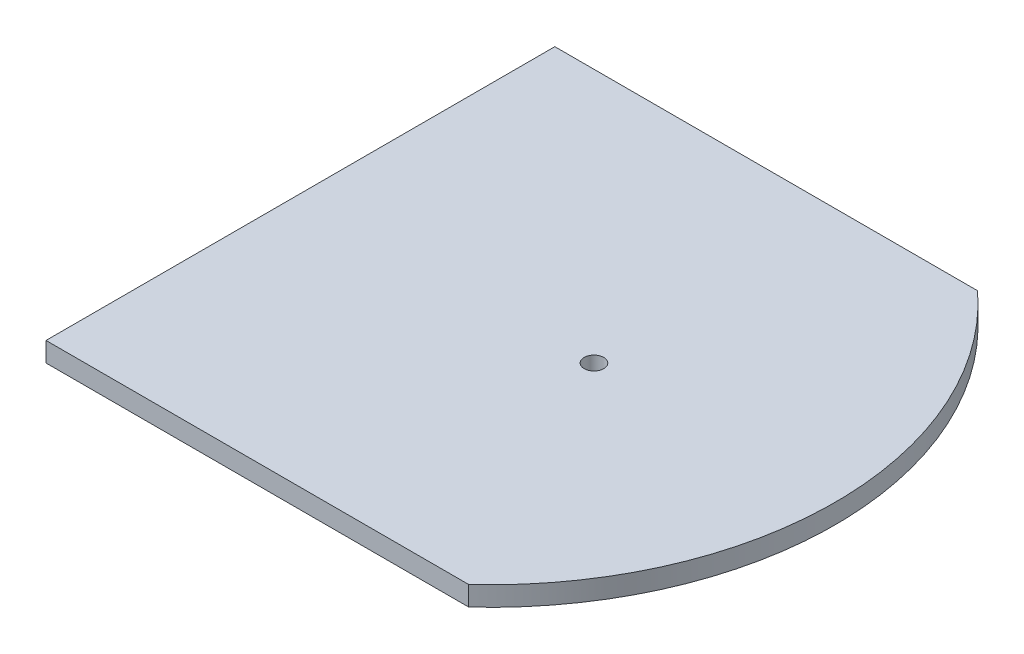
ISO-10303-21;
HEADER;
FILE_DESCRIPTION(('STEP AP214'),'2;1');
FILE_NAME('part.step','',(''),(''),'','','');
FILE_SCHEMA(('AUTOMOTIVE_DESIGN { 1 0 10303 214 1 1 1 1 }'));
ENDSEC;
DATA;
#1=APPLICATION_CONTEXT('core data for automotive mechanical design processes');
#2=APPLICATION_PROTOCOL_DEFINITION('international standard','automotive_design',2000,#1);
#3=PRODUCT_CONTEXT('',#1,'mechanical');
#4=PRODUCT('Part','Part','',(#3));
#5=PRODUCT_RELATED_PRODUCT_CATEGORY('part','',(#4));
#6=PRODUCT_DEFINITION_FORMATION('','',#4);
#7=PRODUCT_DEFINITION_CONTEXT('part definition',#1,'design');
#8=PRODUCT_DEFINITION('design','',#6,#7);
#9=PRODUCT_DEFINITION_SHAPE('','',#8);
#10=(LENGTH_UNIT() NAMED_UNIT(*) SI_UNIT(.MILLI.,.METRE.));
#11=(NAMED_UNIT(*) PLANE_ANGLE_UNIT() SI_UNIT($,.RADIAN.));
#12=(NAMED_UNIT(*) SI_UNIT($,.STERADIAN.) SOLID_ANGLE_UNIT());
#13=UNCERTAINTY_MEASURE_WITH_UNIT(LENGTH_MEASURE(1.E-05),#10,'distance_accuracy_value','');
#14=(GEOMETRIC_REPRESENTATION_CONTEXT(3) GLOBAL_UNCERTAINTY_ASSIGNED_CONTEXT((#13)) GLOBAL_UNIT_ASSIGNED_CONTEXT((#10,
#11,#12)) REPRESENTATION_CONTEXT('',''));
#15=CARTESIAN_POINT('',(0.,0.,0.));
#16=DIRECTION('',(0.,0.,1.));
#17=DIRECTION('',(1.,0.,0.));
#18=AXIS2_PLACEMENT_3D('',#15,#16,#17);
#19=CARTESIAN_POINT('',(48.515175396547,5.,65.));
#20=DIRECTION('',(0.,-1.,0.));
#21=DIRECTION('',(0.,0.,-1.));
#22=AXIS2_PLACEMENT_3D('',#19,#20,#21);
#23=PLANE('',#22);
#24=DIRECTION('',(0.,0.,1.));
#25=VECTOR('',#24,1.);
#26=CARTESIAN_POINT('',(0.,5.,0.));
#27=LINE('',#26,#25);
#28=CARTESIAN_POINT('',(0.,5.,0.));
#29=VERTEX_POINT('',#28);
#30=CARTESIAN_POINT('',(0.,5.,130.));
#31=VERTEX_POINT('',#30);
#32=EDGE_CURVE('E85',#29,#31,#27,.T.);
#33=ORIENTED_EDGE('',*,*,#32,.T.);
#34=DIRECTION('',(1.,0.,0.));
#35=VECTOR('',#34,1.);
#36=CARTESIAN_POINT('',(0.,5.,130.));
#37=LINE('',#36,#35);
#38=CARTESIAN_POINT('',(108.,5.,130.));
#39=VERTEX_POINT('',#38);
#40=EDGE_CURVE('E80',#31,#39,#37,.T.);
#41=ORIENTED_EDGE('',*,*,#40,.T.);
#42=CARTESIAN_POINT('',(48.515175396547,5.,65.));
#43=DIRECTION('',(0.,1.,0.));
#44=DIRECTION('',(0.,0.,-1.));
#45=AXIS2_PLACEMENT_3D('',#42,#43,#44);
#46=CIRCLE('',#45,88.1104100438964);
#47=CARTESIAN_POINT('',(108.,5.,0.));
#48=VERTEX_POINT('',#47);
#49=EDGE_CURVE('E83',#39,#48,#46,.T.);
#50=ORIENTED_EDGE('',*,*,#49,.T.);
#51=DIRECTION('',(-1.,0.,0.));
#52=VECTOR('',#51,1.);
#53=CARTESIAN_POINT('',(0.,5.,0.));
#54=LINE('',#53,#52);
#55=EDGE_CURVE('E50',#48,#29,#54,.T.);
#56=ORIENTED_EDGE('',*,*,#55,.T.);
#57=EDGE_LOOP('',(#33,#41,#50,#56));
#58=FACE_BOUND('',#57,.T.);
#59=CARTESIAN_POINT('',(75.,5.,65.));
#60=DIRECTION('',(0.,1.,0.));
#61=DIRECTION('',(0.,0.,1.));
#62=AXIS2_PLACEMENT_3D('',#59,#60,#61);
#63=CIRCLE('',#62,2.50000000000001);
#64=CARTESIAN_POINT('',(75.,5.,67.5));
#65=VERTEX_POINT('',#64);
#66=EDGE_CURVE('E100',#65,#65,#63,.T.);
#67=ORIENTED_EDGE('',*,*,#66,.F.);
#68=EDGE_LOOP('',(#67));
#69=FACE_BOUND('',#68,.T.);
#70=ADVANCED_FACE('F33',(#58,#69),#23,.F.);
#71=CARTESIAN_POINT('',(48.515175396547,0.,65.));
#72=DIRECTION('',(0.,-1.,0.));
#73=DIRECTION('',(0.,0.,-1.));
#74=AXIS2_PLACEMENT_3D('',#71,#72,#73);
#75=PLANE('',#74);
#76=DIRECTION('',(0.,0.,1.));
#77=VECTOR('',#76,1.);
#78=CARTESIAN_POINT('',(0.,0.,0.));
#79=LINE('',#78,#77);
#80=CARTESIAN_POINT('',(0.,0.,0.));
#81=VERTEX_POINT('',#80);
#82=CARTESIAN_POINT('',(0.,0.,130.));
#83=VERTEX_POINT('',#82);
#84=EDGE_CURVE('E97',#81,#83,#79,.T.);
#85=ORIENTED_EDGE('',*,*,#84,.F.);
#86=DIRECTION('',(-1.,0.,0.));
#87=VECTOR('',#86,1.);
#88=CARTESIAN_POINT('',(0.,0.,0.));
#89=LINE('',#88,#87);
#90=CARTESIAN_POINT('',(108.,0.,0.));
#91=VERTEX_POINT('',#90);
#92=EDGE_CURVE('E73',#91,#81,#89,.T.);
#93=ORIENTED_EDGE('',*,*,#92,.F.);
#94=CARTESIAN_POINT('',(48.515175396547,0.,65.));
#95=DIRECTION('',(0.,1.,0.));
#96=DIRECTION('',(0.,0.,-1.));
#97=AXIS2_PLACEMENT_3D('',#94,#95,#96);
#98=CIRCLE('',#97,88.1104100438964);
#99=CARTESIAN_POINT('',(108.,0.,130.));
#100=VERTEX_POINT('',#99);
#101=EDGE_CURVE('E67',#100,#91,#98,.T.);
#102=ORIENTED_EDGE('',*,*,#101,.F.);
#103=DIRECTION('',(1.,0.,0.));
#104=VECTOR('',#103,1.);
#105=CARTESIAN_POINT('',(0.,0.,130.));
#106=LINE('',#105,#104);
#107=EDGE_CURVE('E89',#83,#100,#106,.T.);
#108=ORIENTED_EDGE('',*,*,#107,.F.);
#109=EDGE_LOOP('',(#85,#93,#102,#108));
#110=FACE_BOUND('',#109,.T.);
#111=CARTESIAN_POINT('',(75.,0.,65.));
#112=DIRECTION('',(0.,1.,0.));
#113=DIRECTION('',(0.,0.,1.));
#114=AXIS2_PLACEMENT_3D('',#111,#112,#113);
#115=CIRCLE('',#114,2.50000000000001);
#116=CARTESIAN_POINT('',(75.,0.,67.5));
#117=VERTEX_POINT('',#116);
#118=EDGE_CURVE('E112',#117,#117,#115,.T.);
#119=ORIENTED_EDGE('',*,*,#118,.T.);
#120=EDGE_LOOP('',(#119));
#121=FACE_BOUND('',#120,.T.);
#122=ADVANCED_FACE('F108',(#110,#121),#75,.T.);
#123=CARTESIAN_POINT('',(0.,5.,0.));
#124=DIRECTION('',(1.,0.,0.));
#125=DIRECTION('',(0.,0.,-1.));
#126=AXIS2_PLACEMENT_3D('',#123,#124,#125);
#127=PLANE('',#126);
#128=ORIENTED_EDGE('',*,*,#84,.T.);
#129=DIRECTION('',(0.,-1.,0.));
#130=VECTOR('',#129,1.);
#131=CARTESIAN_POINT('',(0.,5.,130.));
#132=LINE('',#131,#130);
#133=EDGE_CURVE('E11',#31,#83,#132,.T.);
#134=ORIENTED_EDGE('',*,*,#133,.F.);
#135=ORIENTED_EDGE('',*,*,#32,.F.);
#136=DIRECTION('',(0.,-1.,0.));
#137=VECTOR('',#136,1.);
#138=CARTESIAN_POINT('',(0.,5.,0.));
#139=LINE('',#138,#137);
#140=EDGE_CURVE('E93',#29,#81,#139,.T.);
#141=ORIENTED_EDGE('',*,*,#140,.T.);
#142=EDGE_LOOP('',(#128,#134,#135,#141));
#143=FACE_BOUND('',#142,.T.);
#144=ADVANCED_FACE('F35',(#143),#127,.F.);
#145=CARTESIAN_POINT('',(0.,5.,130.));
#146=DIRECTION('',(0.,0.,-1.));
#147=DIRECTION('',(-1.,0.,0.));
#148=AXIS2_PLACEMENT_3D('',#145,#146,#147);
#149=PLANE('',#148);
#150=ORIENTED_EDGE('',*,*,#107,.T.);
#151=DIRECTION('',(0.,-1.,0.));
#152=VECTOR('',#151,1.);
#153=CARTESIAN_POINT('',(108.,5.,130.));
#154=LINE('',#153,#152);
#155=EDGE_CURVE('E42',#39,#100,#154,.T.);
#156=ORIENTED_EDGE('',*,*,#155,.F.);
#157=ORIENTED_EDGE('',*,*,#40,.F.);
#158=ORIENTED_EDGE('',*,*,#133,.T.);
#159=EDGE_LOOP('',(#150,#156,#157,#158));
#160=FACE_BOUND('',#159,.T.);
#161=ADVANCED_FACE('F88',(#160),#149,.F.);
#162=CARTESIAN_POINT('',(48.515175396547,5.,65.));
#163=DIRECTION('',(0.,-1.,0.));
#164=DIRECTION('',(0.,0.,-1.));
#165=AXIS2_PLACEMENT_3D('',#162,#163,#164);
#166=CYLINDRICAL_SURFACE('',#165,88.1104100438964);
#167=ORIENTED_EDGE('',*,*,#101,.T.);
#168=DIRECTION('',(0.,-1.,0.));
#169=VECTOR('',#168,1.);
#170=CARTESIAN_POINT('',(108.,5.,0.));
#171=LINE('',#170,#169);
#172=EDGE_CURVE('E90',#48,#91,#171,.T.);
#173=ORIENTED_EDGE('',*,*,#172,.F.);
#174=ORIENTED_EDGE('',*,*,#49,.F.);
#175=ORIENTED_EDGE('',*,*,#155,.T.);
#176=EDGE_LOOP('',(#167,#173,#174,#175));
#177=FACE_BOUND('',#176,.T.);
#178=ADVANCED_FACE('F91',(#177),#166,.T.);
#179=CARTESIAN_POINT('',(0.,5.,0.));
#180=DIRECTION('',(0.,0.,1.));
#181=DIRECTION('',(1.,0.,0.));
#182=AXIS2_PLACEMENT_3D('',#179,#180,#181);
#183=PLANE('',#182);
#184=ORIENTED_EDGE('',*,*,#92,.T.);
#185=ORIENTED_EDGE('',*,*,#140,.F.);
#186=ORIENTED_EDGE('',*,*,#55,.F.);
#187=ORIENTED_EDGE('',*,*,#172,.T.);
#188=EDGE_LOOP('',(#184,#185,#186,#187));
#189=FACE_BOUND('',#188,.T.);
#190=ADVANCED_FACE('F105',(#189),#183,.F.);
#191=CARTESIAN_POINT('',(75.,5.,65.));
#192=DIRECTION('',(0.,-1.,0.));
#193=DIRECTION('',(0.,0.,-1.));
#194=AXIS2_PLACEMENT_3D('',#191,#192,#193);
#195=CYLINDRICAL_SURFACE('',#194,2.50000000000001);
#196=ORIENTED_EDGE('',*,*,#66,.T.);
#197=EDGE_LOOP('',(#196));
#198=FACE_BOUND('',#197,.T.);
#199=ORIENTED_EDGE('',*,*,#118,.F.);
#200=EDGE_LOOP('',(#199));
#201=FACE_BOUND('',#200,.T.);
#202=ADVANCED_FACE('F118',(#198,#201),#195,.F.);
#203=CLOSED_SHELL('',(#70,#122,#144,#161,#178,#190,#202));
#204=MANIFOLD_SOLID_BREP('B2',#203);
#205=ADVANCED_BREP_SHAPE_REPRESENTATION('',(#18,#204),#14);
#206=SHAPE_DEFINITION_REPRESENTATION(#9,#205);
ENDSEC;
END-ISO-10303-21;
